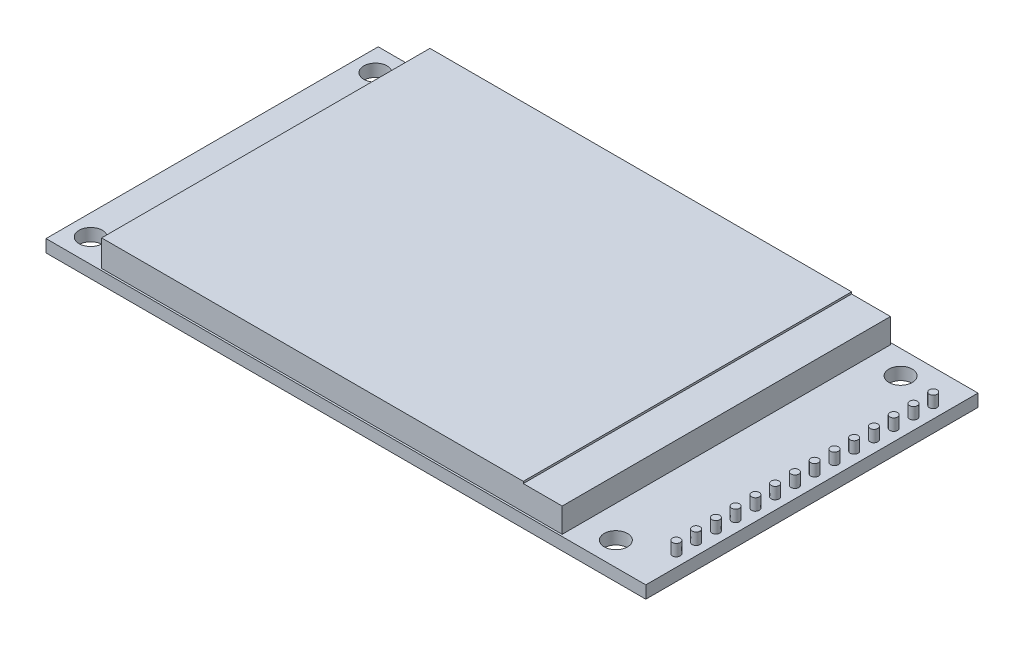
ISO-10303-21;
HEADER;
FILE_DESCRIPTION(('STEP AP214'),'2;1');
FILE_NAME('part.step','',(''),(''),'','','');
FILE_SCHEMA(('AUTOMOTIVE_DESIGN { 1 0 10303 214 1 1 1 1 }'));
ENDSEC;
DATA;
#1=APPLICATION_CONTEXT('core data for automotive mechanical design processes');
#2=APPLICATION_PROTOCOL_DEFINITION('international standard','automotive_design',2000,#1);
#3=PRODUCT_CONTEXT('',#1,'mechanical');
#4=PRODUCT('Part','Part','',(#3));
#5=PRODUCT_RELATED_PRODUCT_CATEGORY('part','',(#4));
#6=PRODUCT_DEFINITION_FORMATION('','',#4);
#7=PRODUCT_DEFINITION_CONTEXT('part definition',#1,'design');
#8=PRODUCT_DEFINITION('design','',#6,#7);
#9=PRODUCT_DEFINITION_SHAPE('','',#8);
#10=(LENGTH_UNIT() NAMED_UNIT(*) SI_UNIT(.MILLI.,.METRE.));
#11=(NAMED_UNIT(*) PLANE_ANGLE_UNIT() SI_UNIT($,.RADIAN.));
#12=(NAMED_UNIT(*) SI_UNIT($,.STERADIAN.) SOLID_ANGLE_UNIT());
#13=UNCERTAINTY_MEASURE_WITH_UNIT(LENGTH_MEASURE(1.E-05),#10,'distance_accuracy_value','');
#14=(GEOMETRIC_REPRESENTATION_CONTEXT(3) GLOBAL_UNCERTAINTY_ASSIGNED_CONTEXT((#13)) GLOBAL_UNIT_ASSIGNED_CONTEXT((#10,
#11,#12)) REPRESENTATION_CONTEXT('',''));
#15=CARTESIAN_POINT('',(0.,0.,0.));
#16=DIRECTION('',(0.,0.,1.));
#17=DIRECTION('',(1.,0.,0.));
#18=AXIS2_PLACEMENT_3D('',#15,#16,#17);
#19=CARTESIAN_POINT('',(27.55,82.7013067282838,21.1));
#20=DIRECTION('',(-1.,0.,0.));
#21=DIRECTION('',(0.,0.,1.));
#22=AXIS2_PLACEMENT_3D('',#19,#20,#21);
#23=PLANE('',#22);
#24=DIRECTION('',(0.,0.,-1.));
#25=VECTOR('',#24,1.);
#26=CARTESIAN_POINT('',(27.55,4.75,21.1));
#27=LINE('',#26,#25);
#28=CARTESIAN_POINT('',(27.55,4.75,21.1));
#29=VERTEX_POINT('',#28);
#30=CARTESIAN_POINT('',(27.55,4.75,-21.1));
#31=VERTEX_POINT('',#30);
#32=EDGE_CURVE('E66',#29,#31,#27,.T.);
#33=ORIENTED_EDGE('',*,*,#32,.F.);
#34=DIRECTION('',(0.,-1.,0.));
#35=VECTOR('',#34,1.);
#36=CARTESIAN_POINT('',(27.55,82.7013067282838,21.1));
#37=LINE('',#36,#35);
#38=CARTESIAN_POINT('',(27.55,1.6,21.1));
#39=VERTEX_POINT('',#38);
#40=EDGE_CURVE('E185',#29,#39,#37,.T.);
#41=ORIENTED_EDGE('',*,*,#40,.T.);
#42=DIRECTION('',(0.,0.,-1.));
#43=VECTOR('',#42,1.);
#44=CARTESIAN_POINT('',(27.55,1.6,21.1));
#45=LINE('',#44,#43);
#46=CARTESIAN_POINT('',(27.55,1.6,-21.1));
#47=VERTEX_POINT('',#46);
#48=EDGE_CURVE('E182',#39,#47,#45,.T.);
#49=ORIENTED_EDGE('',*,*,#48,.T.);
#50=DIRECTION('',(0.,-1.,0.));
#51=VECTOR('',#50,1.);
#52=CARTESIAN_POINT('',(27.55,82.7013067282838,-21.1));
#53=LINE('',#52,#51);
#54=EDGE_CURVE('E181',#31,#47,#53,.T.);
#55=ORIENTED_EDGE('',*,*,#54,.F.);
#56=EDGE_LOOP('',(#33,#41,#49,#55));
#57=FACE_BOUND('',#56,.T.);
#58=ADVANCED_FACE('F43',(#57),#23,.F.);
#59=CARTESIAN_POINT('',(27.55,82.7013067282838,21.1));
#60=DIRECTION('',(0.,0.,-1.));
#61=DIRECTION('',(-1.,0.,0.));
#62=AXIS2_PLACEMENT_3D('',#59,#60,#61);
#63=PLANE('',#62);
#64=DIRECTION('',(1.,0.,0.));
#65=VECTOR('',#64,1.);
#66=CARTESIAN_POINT('',(27.55,4.75,21.1));
#67=LINE('',#66,#65);
#68=CARTESIAN_POINT('',(22.55,4.75,21.1));
#69=VERTEX_POINT('',#68);
#70=EDGE_CURVE('E58',#69,#29,#67,.T.);
#71=ORIENTED_EDGE('',*,*,#70,.F.);
#72=DIRECTION('',(0.,-1.,0.));
#73=VECTOR('',#72,1.);
#74=CARTESIAN_POINT('',(22.55,82.7013067282838,21.1));
#75=LINE('',#74,#73);
#76=CARTESIAN_POINT('',(22.55,5.,21.1));
#77=VERTEX_POINT('',#76);
#78=EDGE_CURVE('E138',#77,#69,#75,.T.);
#79=ORIENTED_EDGE('',*,*,#78,.F.);
#80=DIRECTION('',(1.,0.,0.));
#81=VECTOR('',#80,1.);
#82=CARTESIAN_POINT('',(27.55,5.,21.1));
#83=LINE('',#82,#81);
#84=CARTESIAN_POINT('',(-31.65,5.,21.1));
#85=VERTEX_POINT('',#84);
#86=EDGE_CURVE('E136',#85,#77,#83,.T.);
#87=ORIENTED_EDGE('',*,*,#86,.F.);
#88=DIRECTION('',(0.,-1.,0.));
#89=VECTOR('',#88,1.);
#90=CARTESIAN_POINT('',(-31.65,82.7013067282838,21.1));
#91=LINE('',#90,#89);
#92=CARTESIAN_POINT('',(-31.65,1.6,21.1));
#93=VERTEX_POINT('',#92);
#94=EDGE_CURVE('E189',#85,#93,#91,.T.);
#95=ORIENTED_EDGE('',*,*,#94,.T.);
#96=DIRECTION('',(1.,0.,0.));
#97=VECTOR('',#96,1.);
#98=CARTESIAN_POINT('',(27.55,1.6,21.1));
#99=LINE('',#98,#97);
#100=EDGE_CURVE('E186',#93,#39,#99,.T.);
#101=ORIENTED_EDGE('',*,*,#100,.T.);
#102=ORIENTED_EDGE('',*,*,#40,.F.);
#103=EDGE_LOOP('',(#71,#79,#87,#95,#101,#102));
#104=FACE_BOUND('',#103,.T.);
#105=ADVANCED_FACE('F255',(#104),#63,.F.);
#106=CARTESIAN_POINT('',(27.55,82.7013067282838,-21.1));
#107=DIRECTION('',(0.,0.,1.));
#108=DIRECTION('',(1.,0.,0.));
#109=AXIS2_PLACEMENT_3D('',#106,#107,#108);
#110=PLANE('',#109);
#111=DIRECTION('',(-1.,0.,0.));
#112=VECTOR('',#111,1.);
#113=CARTESIAN_POINT('',(27.55,4.75,-21.1));
#114=LINE('',#113,#112);
#115=CARTESIAN_POINT('',(22.55,4.75,-21.1));
#116=VERTEX_POINT('',#115);
#117=EDGE_CURVE('E151',#31,#116,#114,.T.);
#118=ORIENTED_EDGE('',*,*,#117,.F.);
#119=ORIENTED_EDGE('',*,*,#54,.T.);
#120=DIRECTION('',(-1.,0.,0.));
#121=VECTOR('',#120,1.);
#122=CARTESIAN_POINT('',(27.55,1.6,-21.1));
#123=LINE('',#122,#121);
#124=CARTESIAN_POINT('',(-31.65,1.6,-21.1));
#125=VERTEX_POINT('',#124);
#126=EDGE_CURVE('E130',#47,#125,#123,.T.);
#127=ORIENTED_EDGE('',*,*,#126,.T.);
#128=DIRECTION('',(0.,-1.,0.));
#129=VECTOR('',#128,1.);
#130=CARTESIAN_POINT('',(-31.65,82.7013067282838,-21.1));
#131=LINE('',#130,#129);
#132=CARTESIAN_POINT('',(-31.65,5.,-21.1));
#133=VERTEX_POINT('',#132);
#134=EDGE_CURVE('E125',#133,#125,#131,.T.);
#135=ORIENTED_EDGE('',*,*,#134,.F.);
#136=DIRECTION('',(-1.,0.,0.));
#137=VECTOR('',#136,1.);
#138=CARTESIAN_POINT('',(27.55,5.,-21.1));
#139=LINE('',#138,#137);
#140=CARTESIAN_POINT('',(22.55,5.,-21.1));
#141=VERTEX_POINT('',#140);
#142=EDGE_CURVE('E120',#141,#133,#139,.T.);
#143=ORIENTED_EDGE('',*,*,#142,.F.);
#144=DIRECTION('',(0.,1.,0.));
#145=VECTOR('',#144,1.);
#146=CARTESIAN_POINT('',(22.55,82.7013067282838,-21.1));
#147=LINE('',#146,#145);
#148=EDGE_CURVE('E12',#116,#141,#147,.T.);
#149=ORIENTED_EDGE('',*,*,#148,.F.);
#150=EDGE_LOOP('',(#118,#119,#127,#135,#143,#149));
#151=FACE_BOUND('',#150,.T.);
#152=ADVANCED_FACE('F122',(#151),#110,.F.);
#153=CARTESIAN_POINT('',(0.,1.6,0.));
#154=DIRECTION('',(0.,1.,0.));
#155=DIRECTION('',(0.,0.,1.));
#156=AXIS2_PLACEMENT_3D('',#153,#154,#155);
#157=PLANE('',#156);
#158=CARTESIAN_POINT('',(37.0499999999999,1.6,-17.0967644922255));
#159=DIRECTION('',(0.,1.,0.));
#160=DIRECTION('',(0.,0.,1.));
#161=AXIS2_PLACEMENT_3D('',#158,#159,#160);
#162=CIRCLE('',#161,0.499999999999999);
#163=CARTESIAN_POINT('',(37.0499999999999,1.6,-16.5967644922255));
#164=VERTEX_POINT('',#163);
#165=EDGE_CURVE('E687',#164,#164,#162,.T.);
#166=ORIENTED_EDGE('',*,*,#165,.F.);
#167=EDGE_LOOP('',(#166));
#168=FACE_BOUND('',#167,.T.);
#169=CARTESIAN_POINT('',(37.0499999999999,1.6,-14.5567644922255));
#170=DIRECTION('',(0.,1.,0.));
#171=DIRECTION('',(0.,0.,1.));
#172=AXIS2_PLACEMENT_3D('',#169,#170,#171);
#173=CIRCLE('',#172,0.499999999999999);
#174=CARTESIAN_POINT('',(37.0499999999999,1.6,-14.0567644922255));
#175=VERTEX_POINT('',#174);
#176=EDGE_CURVE('E686',#175,#175,#173,.T.);
#177=ORIENTED_EDGE('',*,*,#176,.F.);
#178=EDGE_LOOP('',(#177));
#179=FACE_BOUND('',#178,.T.);
#180=CARTESIAN_POINT('',(37.0499999999999,1.6,-12.0167644922255));
#181=DIRECTION('',(0.,1.,0.));
#182=DIRECTION('',(0.,0.,1.));
#183=AXIS2_PLACEMENT_3D('',#180,#181,#182);
#184=CIRCLE('',#183,0.499999999999999);
#185=CARTESIAN_POINT('',(37.0499999999999,1.6,-11.5167644922255));
#186=VERTEX_POINT('',#185);
#187=EDGE_CURVE('E696',#186,#186,#184,.T.);
#188=ORIENTED_EDGE('',*,*,#187,.F.);
#189=EDGE_LOOP('',(#188));
#190=FACE_BOUND('',#189,.T.);
#191=CARTESIAN_POINT('',(37.0499999999999,1.6,-9.47676449222553));
#192=DIRECTION('',(0.,1.,0.));
#193=DIRECTION('',(0.,0.,1.));
#194=AXIS2_PLACEMENT_3D('',#191,#192,#193);
#195=CIRCLE('',#194,0.499999999999999);
#196=CARTESIAN_POINT('',(37.0499999999999,1.6,-8.97676449222553));
#197=VERTEX_POINT('',#196);
#198=EDGE_CURVE('E701',#197,#197,#195,.T.);
#199=ORIENTED_EDGE('',*,*,#198,.F.);
#200=EDGE_LOOP('',(#199));
#201=FACE_BOUND('',#200,.T.);
#202=CARTESIAN_POINT('',(37.0499999999999,1.6,-6.93676449222554));
#203=DIRECTION('',(0.,1.,0.));
#204=DIRECTION('',(0.,0.,1.));
#205=AXIS2_PLACEMENT_3D('',#202,#203,#204);
#206=CIRCLE('',#205,0.499999999999999);
#207=CARTESIAN_POINT('',(37.0499999999999,1.6,-6.43676449222554));
#208=VERTEX_POINT('',#207);
#209=EDGE_CURVE('E707',#208,#208,#206,.T.);
#210=ORIENTED_EDGE('',*,*,#209,.F.);
#211=EDGE_LOOP('',(#210));
#212=FACE_BOUND('',#211,.T.);
#213=CARTESIAN_POINT('',(37.0499999999999,1.6,-4.39676449222554));
#214=DIRECTION('',(0.,1.,0.));
#215=DIRECTION('',(0.,0.,1.));
#216=AXIS2_PLACEMENT_3D('',#213,#214,#215);
#217=CIRCLE('',#216,0.499999999999999);
#218=CARTESIAN_POINT('',(37.0499999999999,1.6,-3.89676449222554));
#219=VERTEX_POINT('',#218);
#220=EDGE_CURVE('E713',#219,#219,#217,.T.);
#221=ORIENTED_EDGE('',*,*,#220,.F.);
#222=EDGE_LOOP('',(#221));
#223=FACE_BOUND('',#222,.T.);
#224=CARTESIAN_POINT('',(37.0499999999999,1.6,-1.85676449222554));
#225=DIRECTION('',(0.,1.,0.));
#226=DIRECTION('',(0.,0.,1.));
#227=AXIS2_PLACEMENT_3D('',#224,#225,#226);
#228=CIRCLE('',#227,0.499999999999999);
#229=CARTESIAN_POINT('',(37.0499999999999,1.6,-1.35676449222554));
#230=VERTEX_POINT('',#229);
#231=EDGE_CURVE('E719',#230,#230,#228,.T.);
#232=ORIENTED_EDGE('',*,*,#231,.F.);
#233=EDGE_LOOP('',(#232));
#234=FACE_BOUND('',#233,.T.);
#235=CARTESIAN_POINT('',(37.0499999999999,1.6,0.683235507774462));
#236=DIRECTION('',(0.,1.,0.));
#237=DIRECTION('',(0.,0.,1.));
#238=AXIS2_PLACEMENT_3D('',#235,#236,#237);
#239=CIRCLE('',#238,0.499999999999999);
#240=CARTESIAN_POINT('',(37.0499999999999,1.6,1.18323550777446));
#241=VERTEX_POINT('',#240);
#242=EDGE_CURVE('E725',#241,#241,#239,.T.);
#243=ORIENTED_EDGE('',*,*,#242,.F.);
#244=EDGE_LOOP('',(#243));
#245=FACE_BOUND('',#244,.T.);
#246=CARTESIAN_POINT('',(37.0499999999999,1.6,3.22323550777446));
#247=DIRECTION('',(0.,1.,0.));
#248=DIRECTION('',(0.,0.,1.));
#249=AXIS2_PLACEMENT_3D('',#246,#247,#248);
#250=CIRCLE('',#249,0.499999999999999);
#251=CARTESIAN_POINT('',(37.0499999999999,1.6,3.72323550777446));
#252=VERTEX_POINT('',#251);
#253=EDGE_CURVE('E731',#252,#252,#250,.T.);
#254=ORIENTED_EDGE('',*,*,#253,.F.);
#255=EDGE_LOOP('',(#254));
#256=FACE_BOUND('',#255,.T.);
#257=CARTESIAN_POINT('',(37.0499999999999,1.6,5.76323550777446));
#258=DIRECTION('',(0.,1.,0.));
#259=DIRECTION('',(0.,0.,1.));
#260=AXIS2_PLACEMENT_3D('',#257,#258,#259);
#261=CIRCLE('',#260,0.499999999999999);
#262=CARTESIAN_POINT('',(37.0499999999999,1.6,6.26323550777446));
#263=VERTEX_POINT('',#262);
#264=EDGE_CURVE('E737',#263,#263,#261,.T.);
#265=ORIENTED_EDGE('',*,*,#264,.F.);
#266=EDGE_LOOP('',(#265));
#267=FACE_BOUND('',#266,.T.);
#268=CARTESIAN_POINT('',(37.05,1.6,8.30323550777446));
#269=DIRECTION('',(0.,1.,0.));
#270=DIRECTION('',(0.,0.,1.));
#271=AXIS2_PLACEMENT_3D('',#268,#269,#270);
#272=CIRCLE('',#271,0.499999999999999);
#273=CARTESIAN_POINT('',(37.05,1.6,8.80323550777446));
#274=VERTEX_POINT('',#273);
#275=EDGE_CURVE('E743',#274,#274,#272,.T.);
#276=ORIENTED_EDGE('',*,*,#275,.F.);
#277=EDGE_LOOP('',(#276));
#278=FACE_BOUND('',#277,.T.);
#279=CARTESIAN_POINT('',(37.05,1.6,10.8432355077745));
#280=DIRECTION('',(0.,1.,0.));
#281=DIRECTION('',(0.,0.,1.));
#282=AXIS2_PLACEMENT_3D('',#279,#280,#281);
#283=CIRCLE('',#282,0.499999999999999);
#284=CARTESIAN_POINT('',(37.05,1.6,11.3432355077745));
#285=VERTEX_POINT('',#284);
#286=EDGE_CURVE('E749',#285,#285,#283,.T.);
#287=ORIENTED_EDGE('',*,*,#286,.F.);
#288=EDGE_LOOP('',(#287));
#289=FACE_BOUND('',#288,.T.);
#290=CARTESIAN_POINT('',(37.05,1.6,13.3832355077745));
#291=DIRECTION('',(0.,1.,0.));
#292=DIRECTION('',(0.,0.,1.));
#293=AXIS2_PLACEMENT_3D('',#290,#291,#292);
#294=CIRCLE('',#293,0.499999999999999);
#295=CARTESIAN_POINT('',(37.05,1.6,13.8832355077745));
#296=VERTEX_POINT('',#295);
#297=EDGE_CURVE('E755',#296,#296,#294,.T.);
#298=ORIENTED_EDGE('',*,*,#297,.F.);
#299=EDGE_LOOP('',(#298));
#300=FACE_BOUND('',#299,.T.);
#301=CARTESIAN_POINT('',(37.05,1.6,15.9232355077745));
#302=DIRECTION('',(0.,1.,0.));
#303=DIRECTION('',(0.,0.,1.));
#304=AXIS2_PLACEMENT_3D('',#301,#302,#303);
#305=CIRCLE('',#304,0.499999999999999);
#306=CARTESIAN_POINT('',(37.05,1.6,16.4232355077745));
#307=VERTEX_POINT('',#306);
#308=EDGE_CURVE('E148',#307,#307,#305,.T.);
#309=ORIENTED_EDGE('',*,*,#308,.F.);
#310=EDGE_LOOP('',(#309));
#311=FACE_BOUND('',#310,.T.);
#312=CARTESIAN_POINT('',(31.65,1.6,18.3));
#313=DIRECTION('',(0.,1.,0.));
#314=DIRECTION('',(0.,0.,1.));
#315=AXIS2_PLACEMENT_3D('',#312,#313,#314);
#316=CIRCLE('',#315,1.5);
#317=CARTESIAN_POINT('',(31.65,1.6,19.8));
#318=VERTEX_POINT('',#317);
#319=EDGE_CURVE('E161',#318,#318,#316,.F.);
#320=ORIENTED_EDGE('',*,*,#319,.T.);
#321=EDGE_LOOP('',(#320));
#322=FACE_BOUND('',#321,.T.);
#323=CARTESIAN_POINT('',(31.65,1.6,-18.3));
#324=DIRECTION('',(0.,1.,0.));
#325=DIRECTION('',(0.,0.,1.));
#326=AXIS2_PLACEMENT_3D('',#323,#324,#325);
#327=CIRCLE('',#326,1.5);
#328=CARTESIAN_POINT('',(31.65,1.6,-16.8));
#329=VERTEX_POINT('',#328);
#330=EDGE_CURVE('E167',#329,#329,#327,.F.);
#331=ORIENTED_EDGE('',*,*,#330,.T.);
#332=EDGE_LOOP('',(#331));
#333=FACE_BOUND('',#332,.T.);
#334=CARTESIAN_POINT('',(-35.85,1.6,-18.3));
#335=DIRECTION('',(0.,1.,0.));
#336=DIRECTION('',(0.,0.,1.));
#337=AXIS2_PLACEMENT_3D('',#334,#335,#336);
#338=CIRCLE('',#337,1.5);
#339=CARTESIAN_POINT('',(-35.85,1.6,-16.8));
#340=VERTEX_POINT('',#339);
#341=EDGE_CURVE('E156',#340,#340,#338,.F.);
#342=ORIENTED_EDGE('',*,*,#341,.T.);
#343=EDGE_LOOP('',(#342));
#344=FACE_BOUND('',#343,.T.);
#345=CARTESIAN_POINT('',(-35.85,1.6,18.3));
#346=DIRECTION('',(0.,1.,0.));
#347=DIRECTION('',(0.,0.,1.));
#348=AXIS2_PLACEMENT_3D('',#345,#346,#347);
#349=CIRCLE('',#348,1.5);
#350=CARTESIAN_POINT('',(-35.85,1.6,19.8));
#351=VERTEX_POINT('',#350);
#352=EDGE_CURVE('E160',#351,#351,#349,.F.);
#353=ORIENTED_EDGE('',*,*,#352,.T.);
#354=EDGE_LOOP('',(#353));
#355=FACE_BOUND('',#354,.T.);
#356=DIRECTION('',(0.,0.,1.));
#357=VECTOR('',#356,1.);
#358=CARTESIAN_POINT('',(-38.55,1.6,21.35));
#359=LINE('',#358,#357);
#360=CARTESIAN_POINT('',(-38.55,1.6,-21.35));
#361=VERTEX_POINT('',#360);
#362=CARTESIAN_POINT('',(-38.55,1.6,21.35));
#363=VERTEX_POINT('',#362);
#364=EDGE_CURVE('E200',#361,#363,#359,.T.);
#365=ORIENTED_EDGE('',*,*,#364,.T.);
#366=DIRECTION('',(1.,0.,0.));
#367=VECTOR('',#366,1.);
#368=CARTESIAN_POINT('',(38.55,1.6,21.35));
#369=LINE('',#368,#367);
#370=CARTESIAN_POINT('',(38.55,1.6,21.35));
#371=VERTEX_POINT('',#370);
#372=EDGE_CURVE('E203',#363,#371,#369,.T.);
#373=ORIENTED_EDGE('',*,*,#372,.T.);
#374=DIRECTION('',(0.,0.,-1.));
#375=VECTOR('',#374,1.);
#376=CARTESIAN_POINT('',(38.55,1.6,21.35));
#377=LINE('',#376,#375);
#378=CARTESIAN_POINT('',(38.55,1.6,-21.35));
#379=VERTEX_POINT('',#378);
#380=EDGE_CURVE('E206',#371,#379,#377,.T.);
#381=ORIENTED_EDGE('',*,*,#380,.T.);
#382=DIRECTION('',(-1.,0.,0.));
#383=VECTOR('',#382,1.);
#384=CARTESIAN_POINT('',(38.55,1.6,-21.35));
#385=LINE('',#384,#383);
#386=EDGE_CURVE('E208',#379,#361,#385,.T.);
#387=ORIENTED_EDGE('',*,*,#386,.T.);
#388=EDGE_LOOP('',(#365,#373,#381,#387));
#389=FACE_BOUND('',#388,.T.);
#390=ORIENTED_EDGE('',*,*,#100,.F.);
#391=DIRECTION('',(0.,0.,1.));
#392=VECTOR('',#391,1.);
#393=CARTESIAN_POINT('',(-31.65,1.6,21.1));
#394=LINE('',#393,#392);
#395=EDGE_CURVE('E190',#125,#93,#394,.T.);
#396=ORIENTED_EDGE('',*,*,#395,.F.);
#397=ORIENTED_EDGE('',*,*,#126,.F.);
#398=ORIENTED_EDGE('',*,*,#48,.F.);
#399=EDGE_LOOP('',(#390,#396,#397,#398));
#400=FACE_BOUND('',#399,.T.);
#401=ADVANCED_FACE('F246',(#168,#179,#190,#201,#212,#223,#234,#245,#256,#267,#278,#289,#300,
#311,#322,#333,#344,#355,#389,#400),#157,.T.);
#402=CARTESIAN_POINT('',(-38.55,1.6,21.35));
#403=DIRECTION('',(1.,0.,0.));
#404=DIRECTION('',(0.,0.,-1.));
#405=AXIS2_PLACEMENT_3D('',#402,#403,#404);
#406=PLANE('',#405);
#407=DIRECTION('',(0.,0.,1.));
#408=VECTOR('',#407,1.);
#409=CARTESIAN_POINT('',(-38.55,0.,21.35));
#410=LINE('',#409,#408);
#411=CARTESIAN_POINT('',(-38.55,0.,-21.35));
#412=VERTEX_POINT('',#411);
#413=CARTESIAN_POINT('',(-38.55,0.,21.35));
#414=VERTEX_POINT('',#413);
#415=EDGE_CURVE('E194',#412,#414,#410,.T.);
#416=ORIENTED_EDGE('',*,*,#415,.T.);
#417=DIRECTION('',(0.,-1.,0.));
#418=VECTOR('',#417,1.);
#419=CARTESIAN_POINT('',(-38.55,1.6,21.35));
#420=LINE('',#419,#418);
#421=EDGE_CURVE('E51',#363,#414,#420,.T.);
#422=ORIENTED_EDGE('',*,*,#421,.F.);
#423=ORIENTED_EDGE('',*,*,#364,.F.);
#424=DIRECTION('',(0.,-1.,0.));
#425=VECTOR('',#424,1.);
#426=CARTESIAN_POINT('',(-38.55,1.6,-21.35));
#427=LINE('',#426,#425);
#428=EDGE_CURVE('E210',#361,#412,#427,.T.);
#429=ORIENTED_EDGE('',*,*,#428,.T.);
#430=EDGE_LOOP('',(#416,#422,#423,#429));
#431=FACE_BOUND('',#430,.T.);
#432=ADVANCED_FACE('F45',(#431),#406,.F.);
#433=CARTESIAN_POINT('',(38.55,1.6,21.35));
#434=DIRECTION('',(0.,0.,-1.));
#435=DIRECTION('',(-1.,0.,0.));
#436=AXIS2_PLACEMENT_3D('',#433,#434,#435);
#437=PLANE('',#436);
#438=DIRECTION('',(1.,0.,0.));
#439=VECTOR('',#438,1.);
#440=CARTESIAN_POINT('',(38.55,0.,21.35));
#441=LINE('',#440,#439);
#442=CARTESIAN_POINT('',(38.55,0.,21.35));
#443=VERTEX_POINT('',#442);
#444=EDGE_CURVE('E213',#414,#443,#441,.T.);
#445=ORIENTED_EDGE('',*,*,#444,.T.);
#446=DIRECTION('',(0.,-1.,0.));
#447=VECTOR('',#446,1.);
#448=CARTESIAN_POINT('',(38.55,1.6,21.35));
#449=LINE('',#448,#447);
#450=EDGE_CURVE('E223',#371,#443,#449,.T.);
#451=ORIENTED_EDGE('',*,*,#450,.F.);
#452=ORIENTED_EDGE('',*,*,#372,.F.);
#453=ORIENTED_EDGE('',*,*,#421,.T.);
#454=EDGE_LOOP('',(#445,#451,#452,#453));
#455=FACE_BOUND('',#454,.T.);
#456=ADVANCED_FACE('F228',(#455),#437,.F.);
#457=CARTESIAN_POINT('',(38.55,1.6,21.35));
#458=DIRECTION('',(-1.,0.,0.));
#459=DIRECTION('',(0.,0.,1.));
#460=AXIS2_PLACEMENT_3D('',#457,#458,#459);
#461=PLANE('',#460);
#462=DIRECTION('',(0.,0.,-1.));
#463=VECTOR('',#462,1.);
#464=CARTESIAN_POINT('',(38.55,0.,21.35));
#465=LINE('',#464,#463);
#466=CARTESIAN_POINT('',(38.55,0.,-21.35));
#467=VERTEX_POINT('',#466);
#468=EDGE_CURVE('E215',#443,#467,#465,.T.);
#469=ORIENTED_EDGE('',*,*,#468,.T.);
#470=DIRECTION('',(0.,-1.,0.));
#471=VECTOR('',#470,1.);
#472=CARTESIAN_POINT('',(38.55,1.6,-21.35));
#473=LINE('',#472,#471);
#474=EDGE_CURVE('E220',#379,#467,#473,.T.);
#475=ORIENTED_EDGE('',*,*,#474,.F.);
#476=ORIENTED_EDGE('',*,*,#380,.F.);
#477=ORIENTED_EDGE('',*,*,#450,.T.);
#478=EDGE_LOOP('',(#469,#475,#476,#477));
#479=FACE_BOUND('',#478,.T.);
#480=ADVANCED_FACE('F240',(#479),#461,.F.);
#481=CARTESIAN_POINT('',(38.55,1.6,-21.35));
#482=DIRECTION('',(0.,0.,1.));
#483=DIRECTION('',(1.,0.,0.));
#484=AXIS2_PLACEMENT_3D('',#481,#482,#483);
#485=PLANE('',#484);
#486=DIRECTION('',(-1.,0.,0.));
#487=VECTOR('',#486,1.);
#488=CARTESIAN_POINT('',(38.55,0.,-21.35));
#489=LINE('',#488,#487);
#490=EDGE_CURVE('E204',#467,#412,#489,.T.);
#491=ORIENTED_EDGE('',*,*,#490,.T.);
#492=ORIENTED_EDGE('',*,*,#428,.F.);
#493=ORIENTED_EDGE('',*,*,#386,.F.);
#494=ORIENTED_EDGE('',*,*,#474,.T.);
#495=EDGE_LOOP('',(#491,#492,#493,#494));
#496=FACE_BOUND('',#495,.T.);
#497=ADVANCED_FACE('F244',(#496),#485,.F.);
#498=CARTESIAN_POINT('',(0.,0.,0.));
#499=DIRECTION('',(0.,1.,0.));
#500=DIRECTION('',(0.,0.,1.));
#501=AXIS2_PLACEMENT_3D('',#498,#499,#500);
#502=PLANE('',#501);
#503=CARTESIAN_POINT('',(31.65,0.,18.3));
#504=DIRECTION('',(0.,-1.,0.));
#505=DIRECTION('',(0.,0.,-1.));
#506=AXIS2_PLACEMENT_3D('',#503,#504,#505);
#507=CIRCLE('',#506,1.5);
#508=CARTESIAN_POINT('',(31.65,0.,16.8));
#509=VERTEX_POINT('',#508);
#510=EDGE_CURVE('E157',#509,#509,#507,.T.);
#511=ORIENTED_EDGE('',*,*,#510,.F.);
#512=EDGE_LOOP('',(#511));
#513=FACE_BOUND('',#512,.T.);
#514=CARTESIAN_POINT('',(31.65,0.,-18.3));
#515=DIRECTION('',(0.,-1.,0.));
#516=DIRECTION('',(0.,0.,-1.));
#517=AXIS2_PLACEMENT_3D('',#514,#515,#516);
#518=CIRCLE('',#517,1.5);
#519=CARTESIAN_POINT('',(31.65,0.,-19.8));
#520=VERTEX_POINT('',#519);
#521=EDGE_CURVE('E164',#520,#520,#518,.T.);
#522=ORIENTED_EDGE('',*,*,#521,.F.);
#523=EDGE_LOOP('',(#522));
#524=FACE_BOUND('',#523,.T.);
#525=CARTESIAN_POINT('',(-35.85,0.,-18.3));
#526=DIRECTION('',(0.,-1.,0.));
#527=DIRECTION('',(0.,0.,-1.));
#528=AXIS2_PLACEMENT_3D('',#525,#526,#527);
#529=CIRCLE('',#528,1.5);
#530=CARTESIAN_POINT('',(-35.85,0.,-19.8));
#531=VERTEX_POINT('',#530);
#532=EDGE_CURVE('E170',#531,#531,#529,.T.);
#533=ORIENTED_EDGE('',*,*,#532,.F.);
#534=EDGE_LOOP('',(#533));
#535=FACE_BOUND('',#534,.T.);
#536=CARTESIAN_POINT('',(-35.85,0.,18.3));
#537=DIRECTION('',(0.,-1.,0.));
#538=DIRECTION('',(0.,0.,-1.));
#539=AXIS2_PLACEMENT_3D('',#536,#537,#538);
#540=CIRCLE('',#539,1.5);
#541=CARTESIAN_POINT('',(-35.85,0.,16.8));
#542=VERTEX_POINT('',#541);
#543=EDGE_CURVE('E175',#542,#542,#540,.T.);
#544=ORIENTED_EDGE('',*,*,#543,.F.);
#545=EDGE_LOOP('',(#544));
#546=FACE_BOUND('',#545,.T.);
#547=ORIENTED_EDGE('',*,*,#415,.F.);
#548=ORIENTED_EDGE('',*,*,#490,.F.);
#549=ORIENTED_EDGE('',*,*,#468,.F.);
#550=ORIENTED_EDGE('',*,*,#444,.F.);
#551=EDGE_LOOP('',(#547,#548,#549,#550));
#552=FACE_BOUND('',#551,.T.);
#553=ADVANCED_FACE('F236',(#513,#524,#535,#546,#552),#502,.F.);
#554=CARTESIAN_POINT('',(-31.65,82.7013067282838,21.1));
#555=DIRECTION('',(1.,0.,0.));
#556=DIRECTION('',(0.,0.,-1.));
#557=AXIS2_PLACEMENT_3D('',#554,#555,#556);
#558=PLANE('',#557);
#559=DIRECTION('',(0.,0.,1.));
#560=VECTOR('',#559,1.);
#561=CARTESIAN_POINT('',(-31.65,5.,21.1));
#562=LINE('',#561,#560);
#563=EDGE_CURVE('E129',#133,#85,#562,.T.);
#564=ORIENTED_EDGE('',*,*,#563,.F.);
#565=ORIENTED_EDGE('',*,*,#134,.T.);
#566=ORIENTED_EDGE('',*,*,#395,.T.);
#567=ORIENTED_EDGE('',*,*,#94,.F.);
#568=EDGE_LOOP('',(#564,#565,#566,#567));
#569=FACE_BOUND('',#568,.T.);
#570=ADVANCED_FACE('F258',(#569),#558,.F.);
#571=CARTESIAN_POINT('',(0.,5.,0.));
#572=DIRECTION('',(0.,1.,0.));
#573=DIRECTION('',(0.,0.,1.));
#574=AXIS2_PLACEMENT_3D('',#571,#572,#573);
#575=PLANE('',#574);
#576=DIRECTION('',(0.,0.,1.));
#577=VECTOR('',#576,1.);
#578=CARTESIAN_POINT('',(22.55,5.,-21.1005132397331));
#579=LINE('',#578,#577);
#580=EDGE_CURVE('E134',#141,#77,#579,.T.);
#581=ORIENTED_EDGE('',*,*,#580,.F.);
#582=ORIENTED_EDGE('',*,*,#142,.T.);
#583=ORIENTED_EDGE('',*,*,#563,.T.);
#584=ORIENTED_EDGE('',*,*,#86,.T.);
#585=EDGE_LOOP('',(#581,#582,#583,#584));
#586=FACE_BOUND('',#585,.T.);
#587=ADVANCED_FACE('F135',(#586),#575,.T.);
#588=CARTESIAN_POINT('',(-35.85,5.001,18.3));
#589=DIRECTION('',(0.,-1.,0.));
#590=DIRECTION('',(0.,0.,-1.));
#591=AXIS2_PLACEMENT_3D('',#588,#589,#590);
#592=CYLINDRICAL_SURFACE('',#591,1.5);
#593=ORIENTED_EDGE('',*,*,#352,.F.);
#594=EDGE_LOOP('',(#593));
#595=FACE_BOUND('',#594,.T.);
#596=ORIENTED_EDGE('',*,*,#543,.T.);
#597=EDGE_LOOP('',(#596));
#598=FACE_BOUND('',#597,.T.);
#599=ADVANCED_FACE('F271',(#595,#598),#592,.F.);
#600=CARTESIAN_POINT('',(-35.85,5.001,-18.3));
#601=DIRECTION('',(0.,-1.,0.));
#602=DIRECTION('',(0.,0.,-1.));
#603=AXIS2_PLACEMENT_3D('',#600,#601,#602);
#604=CYLINDRICAL_SURFACE('',#603,1.5);
#605=ORIENTED_EDGE('',*,*,#341,.F.);
#606=EDGE_LOOP('',(#605));
#607=FACE_BOUND('',#606,.T.);
#608=ORIENTED_EDGE('',*,*,#532,.T.);
#609=EDGE_LOOP('',(#608));
#610=FACE_BOUND('',#609,.T.);
#611=ADVANCED_FACE('F326',(#607,#610),#604,.F.);
#612=CARTESIAN_POINT('',(31.65,5.001,-18.3));
#613=DIRECTION('',(0.,-1.,0.));
#614=DIRECTION('',(0.,0.,-1.));
#615=AXIS2_PLACEMENT_3D('',#612,#613,#614);
#616=CYLINDRICAL_SURFACE('',#615,1.5);
#617=ORIENTED_EDGE('',*,*,#330,.F.);
#618=EDGE_LOOP('',(#617));
#619=FACE_BOUND('',#618,.T.);
#620=ORIENTED_EDGE('',*,*,#521,.T.);
#621=EDGE_LOOP('',(#620));
#622=FACE_BOUND('',#621,.T.);
#623=ADVANCED_FACE('F315',(#619,#622),#616,.F.);
#624=CARTESIAN_POINT('',(31.65,5.001,18.3));
#625=DIRECTION('',(0.,-1.,0.));
#626=DIRECTION('',(0.,0.,-1.));
#627=AXIS2_PLACEMENT_3D('',#624,#625,#626);
#628=CYLINDRICAL_SURFACE('',#627,1.5);
#629=ORIENTED_EDGE('',*,*,#319,.F.);
#630=EDGE_LOOP('',(#629));
#631=FACE_BOUND('',#630,.T.);
#632=ORIENTED_EDGE('',*,*,#510,.T.);
#633=EDGE_LOOP('',(#632));
#634=FACE_BOUND('',#633,.T.);
#635=ADVANCED_FACE('F310',(#631,#634),#628,.F.);
#636=CARTESIAN_POINT('',(22.55,119.595338596608,-21.1005132397331));
#637=DIRECTION('',(1.,0.,0.));
#638=DIRECTION('',(0.,0.,-1.));
#639=AXIS2_PLACEMENT_3D('',#636,#637,#638);
#640=PLANE('',#639);
#641=ORIENTED_EDGE('',*,*,#580,.T.);
#642=ORIENTED_EDGE('',*,*,#78,.T.);
#643=DIRECTION('',(0.,0.,1.));
#644=VECTOR('',#643,1.);
#645=CARTESIAN_POINT('',(22.55,4.75,-21.1005132397331));
#646=LINE('',#645,#644);
#647=EDGE_CURVE('E139',#116,#69,#646,.T.);
#648=ORIENTED_EDGE('',*,*,#647,.F.);
#649=ORIENTED_EDGE('',*,*,#148,.T.);
#650=EDGE_LOOP('',(#641,#642,#648,#649));
#651=FACE_BOUND('',#650,.T.);
#652=ADVANCED_FACE('F142',(#651),#640,.T.);
#653=CARTESIAN_POINT('',(0.,4.75,0.));
#654=DIRECTION('',(0.,1.,0.));
#655=DIRECTION('',(0.,0.,1.));
#656=AXIS2_PLACEMENT_3D('',#653,#654,#655);
#657=PLANE('',#656);
#658=ORIENTED_EDGE('',*,*,#647,.T.);
#659=ORIENTED_EDGE('',*,*,#70,.T.);
#660=ORIENTED_EDGE('',*,*,#32,.T.);
#661=ORIENTED_EDGE('',*,*,#117,.T.);
#662=EDGE_LOOP('',(#658,#659,#660,#661));
#663=FACE_BOUND('',#662,.T.);
#664=ADVANCED_FACE('F388',(#663),#657,.T.);
#665=CARTESIAN_POINT('',(37.05,3.1,15.9232355077745));
#666=DIRECTION('',(0.,-1.,0.));
#667=DIRECTION('',(0.,0.,-1.));
#668=AXIS2_PLACEMENT_3D('',#665,#666,#667);
#669=CYLINDRICAL_SURFACE('',#668,0.499999999999999);
#670=CARTESIAN_POINT('',(37.05,3.1,15.9232355077745));
#671=DIRECTION('',(0.,1.,0.));
#672=DIRECTION('',(0.,0.,1.));
#673=AXIS2_PLACEMENT_3D('',#670,#671,#672);
#674=CIRCLE('',#673,0.499999999999999);
#675=CARTESIAN_POINT('',(37.05,3.1,16.4232355077745));
#676=VERTEX_POINT('',#675);
#677=EDGE_CURVE('E153',#676,#676,#674,.T.);
#678=ORIENTED_EDGE('',*,*,#677,.F.);
#679=EDGE_LOOP('',(#678));
#680=FACE_BOUND('',#679,.T.);
#681=ORIENTED_EDGE('',*,*,#308,.T.);
#682=EDGE_LOOP('',(#681));
#683=FACE_BOUND('',#682,.T.);
#684=ADVANCED_FACE('F396',(#680,#683),#669,.T.);
#685=CARTESIAN_POINT('',(37.05,3.1,15.9232355077745));
#686=DIRECTION('',(0.,1.,0.));
#687=DIRECTION('',(0.,0.,1.));
#688=AXIS2_PLACEMENT_3D('',#685,#686,#687);
#689=PLANE('',#688);
#690=ORIENTED_EDGE('',*,*,#677,.T.);
#691=EDGE_LOOP('',(#690));
#692=FACE_BOUND('',#691,.T.);
#693=ADVANCED_FACE('F409',(#692),#689,.T.);
#694=CARTESIAN_POINT('',(37.05,3.1,13.3832355077745));
#695=DIRECTION('',(0.,-1.,0.));
#696=DIRECTION('',(0.,0.,-1.));
#697=AXIS2_PLACEMENT_3D('',#694,#695,#696);
#698=CYLINDRICAL_SURFACE('',#697,0.499999999999999);
#699=CARTESIAN_POINT('',(37.05,3.1,13.3832355077745));
#700=DIRECTION('',(0.,1.,0.));
#701=DIRECTION('',(0.,0.,1.));
#702=AXIS2_PLACEMENT_3D('',#699,#700,#701);
#703=CIRCLE('',#702,0.499999999999999);
#704=CARTESIAN_POINT('',(37.05,3.1,13.8832355077745));
#705=VERTEX_POINT('',#704);
#706=EDGE_CURVE('E758',#705,#705,#703,.T.);
#707=ORIENTED_EDGE('',*,*,#706,.F.);
#708=EDGE_LOOP('',(#707));
#709=FACE_BOUND('',#708,.T.);
#710=ORIENTED_EDGE('',*,*,#297,.T.);
#711=EDGE_LOOP('',(#710));
#712=FACE_BOUND('',#711,.T.);
#713=ADVANCED_FACE('F419',(#709,#712),#698,.T.);
#714=CARTESIAN_POINT('',(37.05,3.1,13.3832355077745));
#715=DIRECTION('',(0.,1.,0.));
#716=DIRECTION('',(0.,0.,1.));
#717=AXIS2_PLACEMENT_3D('',#714,#715,#716);
#718=PLANE('',#717);
#719=ORIENTED_EDGE('',*,*,#706,.T.);
#720=EDGE_LOOP('',(#719));
#721=FACE_BOUND('',#720,.T.);
#722=ADVANCED_FACE('F429',(#721),#718,.T.);
#723=CARTESIAN_POINT('',(37.05,3.1,10.8432355077745));
#724=DIRECTION('',(0.,-1.,0.));
#725=DIRECTION('',(0.,0.,-1.));
#726=AXIS2_PLACEMENT_3D('',#723,#724,#725);
#727=CYLINDRICAL_SURFACE('',#726,0.499999999999999);
#728=CARTESIAN_POINT('',(37.05,3.1,10.8432355077745));
#729=DIRECTION('',(0.,1.,0.));
#730=DIRECTION('',(0.,0.,1.));
#731=AXIS2_PLACEMENT_3D('',#728,#729,#730);
#732=CIRCLE('',#731,0.499999999999999);
#733=CARTESIAN_POINT('',(37.05,3.1,11.3432355077745));
#734=VERTEX_POINT('',#733);
#735=EDGE_CURVE('E752',#734,#734,#732,.T.);
#736=ORIENTED_EDGE('',*,*,#735,.F.);
#737=EDGE_LOOP('',(#736));
#738=FACE_BOUND('',#737,.T.);
#739=ORIENTED_EDGE('',*,*,#286,.T.);
#740=EDGE_LOOP('',(#739));
#741=FACE_BOUND('',#740,.T.);
#742=ADVANCED_FACE('F439',(#738,#741),#727,.T.);
#743=CARTESIAN_POINT('',(37.05,3.1,10.8432355077745));
#744=DIRECTION('',(0.,1.,0.));
#745=DIRECTION('',(0.,0.,1.));
#746=AXIS2_PLACEMENT_3D('',#743,#744,#745);
#747=PLANE('',#746);
#748=ORIENTED_EDGE('',*,*,#735,.T.);
#749=EDGE_LOOP('',(#748));
#750=FACE_BOUND('',#749,.T.);
#751=ADVANCED_FACE('F449',(#750),#747,.T.);
#752=CARTESIAN_POINT('',(37.05,3.1,8.30323550777446));
#753=DIRECTION('',(0.,-1.,0.));
#754=DIRECTION('',(0.,0.,-1.));
#755=AXIS2_PLACEMENT_3D('',#752,#753,#754);
#756=CYLINDRICAL_SURFACE('',#755,0.499999999999999);
#757=CARTESIAN_POINT('',(37.05,3.1,8.30323550777446));
#758=DIRECTION('',(0.,1.,0.));
#759=DIRECTION('',(0.,0.,1.));
#760=AXIS2_PLACEMENT_3D('',#757,#758,#759);
#761=CIRCLE('',#760,0.499999999999999);
#762=CARTESIAN_POINT('',(37.05,3.1,8.80323550777446));
#763=VERTEX_POINT('',#762);
#764=EDGE_CURVE('E746',#763,#763,#761,.T.);
#765=ORIENTED_EDGE('',*,*,#764,.F.);
#766=EDGE_LOOP('',(#765));
#767=FACE_BOUND('',#766,.T.);
#768=ORIENTED_EDGE('',*,*,#275,.T.);
#769=EDGE_LOOP('',(#768));
#770=FACE_BOUND('',#769,.T.);
#771=ADVANCED_FACE('F459',(#767,#770),#756,.T.);
#772=CARTESIAN_POINT('',(37.05,3.1,8.30323550777446));
#773=DIRECTION('',(0.,1.,0.));
#774=DIRECTION('',(0.,0.,1.));
#775=AXIS2_PLACEMENT_3D('',#772,#773,#774);
#776=PLANE('',#775);
#777=ORIENTED_EDGE('',*,*,#764,.T.);
#778=EDGE_LOOP('',(#777));
#779=FACE_BOUND('',#778,.T.);
#780=ADVANCED_FACE('F469',(#779),#776,.T.);
#781=CARTESIAN_POINT('',(37.0499999999999,3.1,5.76323550777446));
#782=DIRECTION('',(0.,-1.,0.));
#783=DIRECTION('',(0.,0.,-1.));
#784=AXIS2_PLACEMENT_3D('',#781,#782,#783);
#785=CYLINDRICAL_SURFACE('',#784,0.499999999999999);
#786=CARTESIAN_POINT('',(37.0499999999999,3.1,5.76323550777446));
#787=DIRECTION('',(0.,1.,0.));
#788=DIRECTION('',(0.,0.,1.));
#789=AXIS2_PLACEMENT_3D('',#786,#787,#788);
#790=CIRCLE('',#789,0.499999999999999);
#791=CARTESIAN_POINT('',(37.0499999999999,3.1,6.26323550777446));
#792=VERTEX_POINT('',#791);
#793=EDGE_CURVE('E740',#792,#792,#790,.T.);
#794=ORIENTED_EDGE('',*,*,#793,.F.);
#795=EDGE_LOOP('',(#794));
#796=FACE_BOUND('',#795,.T.);
#797=ORIENTED_EDGE('',*,*,#264,.T.);
#798=EDGE_LOOP('',(#797));
#799=FACE_BOUND('',#798,.T.);
#800=ADVANCED_FACE('F479',(#796,#799),#785,.T.);
#801=CARTESIAN_POINT('',(37.0499999999999,3.1,5.76323550777446));
#802=DIRECTION('',(0.,1.,0.));
#803=DIRECTION('',(0.,0.,1.));
#804=AXIS2_PLACEMENT_3D('',#801,#802,#803);
#805=PLANE('',#804);
#806=ORIENTED_EDGE('',*,*,#793,.T.);
#807=EDGE_LOOP('',(#806));
#808=FACE_BOUND('',#807,.T.);
#809=ADVANCED_FACE('F489',(#808),#805,.T.);
#810=CARTESIAN_POINT('',(37.0499999999999,3.1,3.22323550777446));
#811=DIRECTION('',(0.,-1.,0.));
#812=DIRECTION('',(0.,0.,-1.));
#813=AXIS2_PLACEMENT_3D('',#810,#811,#812);
#814=CYLINDRICAL_SURFACE('',#813,0.499999999999999);
#815=CARTESIAN_POINT('',(37.0499999999999,3.1,3.22323550777446));
#816=DIRECTION('',(0.,1.,0.));
#817=DIRECTION('',(0.,0.,1.));
#818=AXIS2_PLACEMENT_3D('',#815,#816,#817);
#819=CIRCLE('',#818,0.499999999999999);
#820=CARTESIAN_POINT('',(37.0499999999999,3.1,3.72323550777446));
#821=VERTEX_POINT('',#820);
#822=EDGE_CURVE('E734',#821,#821,#819,.T.);
#823=ORIENTED_EDGE('',*,*,#822,.F.);
#824=EDGE_LOOP('',(#823));
#825=FACE_BOUND('',#824,.T.);
#826=ORIENTED_EDGE('',*,*,#253,.T.);
#827=EDGE_LOOP('',(#826));
#828=FACE_BOUND('',#827,.T.);
#829=ADVANCED_FACE('F499',(#825,#828),#814,.T.);
#830=CARTESIAN_POINT('',(37.0499999999999,3.1,3.22323550777446));
#831=DIRECTION('',(0.,1.,0.));
#832=DIRECTION('',(0.,0.,1.));
#833=AXIS2_PLACEMENT_3D('',#830,#831,#832);
#834=PLANE('',#833);
#835=ORIENTED_EDGE('',*,*,#822,.T.);
#836=EDGE_LOOP('',(#835));
#837=FACE_BOUND('',#836,.T.);
#838=ADVANCED_FACE('F509',(#837),#834,.T.);
#839=CARTESIAN_POINT('',(37.0499999999999,3.1,0.683235507774462));
#840=DIRECTION('',(0.,-1.,0.));
#841=DIRECTION('',(0.,0.,-1.));
#842=AXIS2_PLACEMENT_3D('',#839,#840,#841);
#843=CYLINDRICAL_SURFACE('',#842,0.499999999999999);
#844=CARTESIAN_POINT('',(37.0499999999999,3.1,0.683235507774462));
#845=DIRECTION('',(0.,1.,0.));
#846=DIRECTION('',(0.,0.,1.));
#847=AXIS2_PLACEMENT_3D('',#844,#845,#846);
#848=CIRCLE('',#847,0.499999999999999);
#849=CARTESIAN_POINT('',(37.0499999999999,3.1,1.18323550777446));
#850=VERTEX_POINT('',#849);
#851=EDGE_CURVE('E728',#850,#850,#848,.T.);
#852=ORIENTED_EDGE('',*,*,#851,.F.);
#853=EDGE_LOOP('',(#852));
#854=FACE_BOUND('',#853,.T.);
#855=ORIENTED_EDGE('',*,*,#242,.T.);
#856=EDGE_LOOP('',(#855));
#857=FACE_BOUND('',#856,.T.);
#858=ADVANCED_FACE('F519',(#854,#857),#843,.T.);
#859=CARTESIAN_POINT('',(37.0499999999999,3.1,0.683235507774462));
#860=DIRECTION('',(0.,1.,0.));
#861=DIRECTION('',(0.,0.,1.));
#862=AXIS2_PLACEMENT_3D('',#859,#860,#861);
#863=PLANE('',#862);
#864=ORIENTED_EDGE('',*,*,#851,.T.);
#865=EDGE_LOOP('',(#864));
#866=FACE_BOUND('',#865,.T.);
#867=ADVANCED_FACE('F529',(#866),#863,.T.);
#868=CARTESIAN_POINT('',(37.0499999999999,3.1,-1.85676449222554));
#869=DIRECTION('',(0.,-1.,0.));
#870=DIRECTION('',(0.,0.,-1.));
#871=AXIS2_PLACEMENT_3D('',#868,#869,#870);
#872=CYLINDRICAL_SURFACE('',#871,0.499999999999999);
#873=CARTESIAN_POINT('',(37.0499999999999,3.1,-1.85676449222554));
#874=DIRECTION('',(0.,1.,0.));
#875=DIRECTION('',(0.,0.,1.));
#876=AXIS2_PLACEMENT_3D('',#873,#874,#875);
#877=CIRCLE('',#876,0.499999999999999);
#878=CARTESIAN_POINT('',(37.0499999999999,3.1,-1.35676449222554));
#879=VERTEX_POINT('',#878);
#880=EDGE_CURVE('E722',#879,#879,#877,.T.);
#881=ORIENTED_EDGE('',*,*,#880,.F.);
#882=EDGE_LOOP('',(#881));
#883=FACE_BOUND('',#882,.T.);
#884=ORIENTED_EDGE('',*,*,#231,.T.);
#885=EDGE_LOOP('',(#884));
#886=FACE_BOUND('',#885,.T.);
#887=ADVANCED_FACE('F539',(#883,#886),#872,.T.);
#888=CARTESIAN_POINT('',(37.0499999999999,3.1,-1.85676449222554));
#889=DIRECTION('',(0.,1.,0.));
#890=DIRECTION('',(0.,0.,1.));
#891=AXIS2_PLACEMENT_3D('',#888,#889,#890);
#892=PLANE('',#891);
#893=ORIENTED_EDGE('',*,*,#880,.T.);
#894=EDGE_LOOP('',(#893));
#895=FACE_BOUND('',#894,.T.);
#896=ADVANCED_FACE('F549',(#895),#892,.T.);
#897=CARTESIAN_POINT('',(37.0499999999999,3.1,-4.39676449222554));
#898=DIRECTION('',(0.,-1.,0.));
#899=DIRECTION('',(0.,0.,-1.));
#900=AXIS2_PLACEMENT_3D('',#897,#898,#899);
#901=CYLINDRICAL_SURFACE('',#900,0.499999999999999);
#902=CARTESIAN_POINT('',(37.0499999999999,3.1,-4.39676449222554));
#903=DIRECTION('',(0.,1.,0.));
#904=DIRECTION('',(0.,0.,1.));
#905=AXIS2_PLACEMENT_3D('',#902,#903,#904);
#906=CIRCLE('',#905,0.499999999999999);
#907=CARTESIAN_POINT('',(37.0499999999999,3.1,-3.89676449222554));
#908=VERTEX_POINT('',#907);
#909=EDGE_CURVE('E716',#908,#908,#906,.T.);
#910=ORIENTED_EDGE('',*,*,#909,.F.);
#911=EDGE_LOOP('',(#910));
#912=FACE_BOUND('',#911,.T.);
#913=ORIENTED_EDGE('',*,*,#220,.T.);
#914=EDGE_LOOP('',(#913));
#915=FACE_BOUND('',#914,.T.);
#916=ADVANCED_FACE('F559',(#912,#915),#901,.T.);
#917=CARTESIAN_POINT('',(37.0499999999999,3.1,-4.39676449222554));
#918=DIRECTION('',(0.,1.,0.));
#919=DIRECTION('',(0.,0.,1.));
#920=AXIS2_PLACEMENT_3D('',#917,#918,#919);
#921=PLANE('',#920);
#922=ORIENTED_EDGE('',*,*,#909,.T.);
#923=EDGE_LOOP('',(#922));
#924=FACE_BOUND('',#923,.T.);
#925=ADVANCED_FACE('F569',(#924),#921,.T.);
#926=CARTESIAN_POINT('',(37.0499999999999,3.1,-6.93676449222554));
#927=DIRECTION('',(0.,-1.,0.));
#928=DIRECTION('',(0.,0.,-1.));
#929=AXIS2_PLACEMENT_3D('',#926,#927,#928);
#930=CYLINDRICAL_SURFACE('',#929,0.499999999999999);
#931=CARTESIAN_POINT('',(37.0499999999999,3.1,-6.93676449222554));
#932=DIRECTION('',(0.,1.,0.));
#933=DIRECTION('',(0.,0.,1.));
#934=AXIS2_PLACEMENT_3D('',#931,#932,#933);
#935=CIRCLE('',#934,0.499999999999999);
#936=CARTESIAN_POINT('',(37.0499999999999,3.1,-6.43676449222554));
#937=VERTEX_POINT('',#936);
#938=EDGE_CURVE('E710',#937,#937,#935,.T.);
#939=ORIENTED_EDGE('',*,*,#938,.F.);
#940=EDGE_LOOP('',(#939));
#941=FACE_BOUND('',#940,.T.);
#942=ORIENTED_EDGE('',*,*,#209,.T.);
#943=EDGE_LOOP('',(#942));
#944=FACE_BOUND('',#943,.T.);
#945=ADVANCED_FACE('F579',(#941,#944),#930,.T.);
#946=CARTESIAN_POINT('',(37.0499999999999,3.1,-6.93676449222554));
#947=DIRECTION('',(0.,1.,0.));
#948=DIRECTION('',(0.,0.,1.));
#949=AXIS2_PLACEMENT_3D('',#946,#947,#948);
#950=PLANE('',#949);
#951=ORIENTED_EDGE('',*,*,#938,.T.);
#952=EDGE_LOOP('',(#951));
#953=FACE_BOUND('',#952,.T.);
#954=ADVANCED_FACE('F589',(#953),#950,.T.);
#955=CARTESIAN_POINT('',(37.0499999999999,3.1,-9.47676449222553));
#956=DIRECTION('',(0.,-1.,0.));
#957=DIRECTION('',(0.,0.,-1.));
#958=AXIS2_PLACEMENT_3D('',#955,#956,#957);
#959=CYLINDRICAL_SURFACE('',#958,0.499999999999999);
#960=CARTESIAN_POINT('',(37.0499999999999,3.1,-9.47676449222553));
#961=DIRECTION('',(0.,1.,0.));
#962=DIRECTION('',(0.,0.,1.));
#963=AXIS2_PLACEMENT_3D('',#960,#961,#962);
#964=CIRCLE('',#963,0.499999999999999);
#965=CARTESIAN_POINT('',(37.0499999999999,3.1,-8.97676449222553));
#966=VERTEX_POINT('',#965);
#967=EDGE_CURVE('E704',#966,#966,#964,.T.);
#968=ORIENTED_EDGE('',*,*,#967,.F.);
#969=EDGE_LOOP('',(#968));
#970=FACE_BOUND('',#969,.T.);
#971=ORIENTED_EDGE('',*,*,#198,.T.);
#972=EDGE_LOOP('',(#971));
#973=FACE_BOUND('',#972,.T.);
#974=ADVANCED_FACE('F599',(#970,#973),#959,.T.);
#975=CARTESIAN_POINT('',(37.0499999999999,3.1,-9.47676449222553));
#976=DIRECTION('',(0.,1.,0.));
#977=DIRECTION('',(0.,0.,1.));
#978=AXIS2_PLACEMENT_3D('',#975,#976,#977);
#979=PLANE('',#978);
#980=ORIENTED_EDGE('',*,*,#967,.T.);
#981=EDGE_LOOP('',(#980));
#982=FACE_BOUND('',#981,.T.);
#983=ADVANCED_FACE('F609',(#982),#979,.T.);
#984=CARTESIAN_POINT('',(37.0499999999999,3.1,-12.0167644922255));
#985=DIRECTION('',(0.,-1.,0.));
#986=DIRECTION('',(0.,0.,-1.));
#987=AXIS2_PLACEMENT_3D('',#984,#985,#986);
#988=CYLINDRICAL_SURFACE('',#987,0.499999999999999);
#989=CARTESIAN_POINT('',(37.0499999999999,3.1,-12.0167644922255));
#990=DIRECTION('',(0.,1.,0.));
#991=DIRECTION('',(0.,0.,1.));
#992=AXIS2_PLACEMENT_3D('',#989,#990,#991);
#993=CIRCLE('',#992,0.499999999999999);
#994=CARTESIAN_POINT('',(37.0499999999999,3.1,-11.5167644922255));
#995=VERTEX_POINT('',#994);
#996=EDGE_CURVE('E698',#995,#995,#993,.T.);
#997=ORIENTED_EDGE('',*,*,#996,.F.);
#998=EDGE_LOOP('',(#997));
#999=FACE_BOUND('',#998,.T.);
#1000=ORIENTED_EDGE('',*,*,#187,.T.);
#1001=EDGE_LOOP('',(#1000));
#1002=FACE_BOUND('',#1001,.T.);
#1003=ADVANCED_FACE('F619',(#999,#1002),#988,.T.);
#1004=CARTESIAN_POINT('',(37.0499999999999,3.1,-12.0167644922255));
#1005=DIRECTION('',(0.,1.,0.));
#1006=DIRECTION('',(0.,0.,1.));
#1007=AXIS2_PLACEMENT_3D('',#1004,#1005,#1006);
#1008=PLANE('',#1007);
#1009=ORIENTED_EDGE('',*,*,#996,.T.);
#1010=EDGE_LOOP('',(#1009));
#1011=FACE_BOUND('',#1010,.T.);
#1012=ADVANCED_FACE('F629',(#1011),#1008,.T.);
#1013=CARTESIAN_POINT('',(37.0499999999999,3.1,-14.5567644922255));
#1014=DIRECTION('',(0.,-1.,0.));
#1015=DIRECTION('',(0.,0.,-1.));
#1016=AXIS2_PLACEMENT_3D('',#1013,#1014,#1015);
#1017=CYLINDRICAL_SURFACE('',#1016,0.499999999999999);
#1018=CARTESIAN_POINT('',(37.0499999999999,3.1,-14.5567644922255));
#1019=DIRECTION('',(0.,1.,0.));
#1020=DIRECTION('',(0.,0.,1.));
#1021=AXIS2_PLACEMENT_3D('',#1018,#1019,#1020);
#1022=CIRCLE('',#1021,0.499999999999999);
#1023=CARTESIAN_POINT('',(37.0499999999999,3.1,-14.0567644922255));
#1024=VERTEX_POINT('',#1023);
#1025=EDGE_CURVE('E690',#1024,#1024,#1022,.T.);
#1026=ORIENTED_EDGE('',*,*,#1025,.F.);
#1027=EDGE_LOOP('',(#1026));
#1028=FACE_BOUND('',#1027,.T.);
#1029=ORIENTED_EDGE('',*,*,#176,.T.);
#1030=EDGE_LOOP('',(#1029));
#1031=FACE_BOUND('',#1030,.T.);
#1032=ADVANCED_FACE('F639',(#1028,#1031),#1017,.T.);
#1033=CARTESIAN_POINT('',(37.0499999999999,3.1,-14.5567644922255));
#1034=DIRECTION('',(0.,1.,0.));
#1035=DIRECTION('',(0.,0.,1.));
#1036=AXIS2_PLACEMENT_3D('',#1033,#1034,#1035);
#1037=PLANE('',#1036);
#1038=ORIENTED_EDGE('',*,*,#1025,.T.);
#1039=EDGE_LOOP('',(#1038));
#1040=FACE_BOUND('',#1039,.T.);
#1041=ADVANCED_FACE('F649',(#1040),#1037,.T.);
#1042=CARTESIAN_POINT('',(37.0499999999999,3.1,-17.0967644922255));
#1043=DIRECTION('',(0.,-1.,0.));
#1044=DIRECTION('',(0.,0.,-1.));
#1045=AXIS2_PLACEMENT_3D('',#1042,#1043,#1044);
#1046=CYLINDRICAL_SURFACE('',#1045,0.499999999999999);
#1047=CARTESIAN_POINT('',(37.0499999999999,3.1,-17.0967644922255));
#1048=DIRECTION('',(0.,1.,0.));
#1049=DIRECTION('',(0.,0.,1.));
#1050=AXIS2_PLACEMENT_3D('',#1047,#1048,#1049);
#1051=CIRCLE('',#1050,0.499999999999999);
#1052=CARTESIAN_POINT('',(37.0499999999999,3.1,-16.5967644922255));
#1053=VERTEX_POINT('',#1052);
#1054=EDGE_CURVE('E685',#1053,#1053,#1051,.T.);
#1055=ORIENTED_EDGE('',*,*,#1054,.F.);
#1056=EDGE_LOOP('',(#1055));
#1057=FACE_BOUND('',#1056,.T.);
#1058=ORIENTED_EDGE('',*,*,#165,.T.);
#1059=EDGE_LOOP('',(#1058));
#1060=FACE_BOUND('',#1059,.T.);
#1061=ADVANCED_FACE('F659',(#1057,#1060),#1046,.T.);
#1062=CARTESIAN_POINT('',(37.0499999999999,3.1,-17.0967644922255));
#1063=DIRECTION('',(0.,1.,0.));
#1064=DIRECTION('',(0.,0.,1.));
#1065=AXIS2_PLACEMENT_3D('',#1062,#1063,#1064);
#1066=PLANE('',#1065);
#1067=ORIENTED_EDGE('',*,*,#1054,.T.);
#1068=EDGE_LOOP('',(#1067));
#1069=FACE_BOUND('',#1068,.T.);
#1070=ADVANCED_FACE('F669',(#1069),#1066,.T.);
#1071=CLOSED_SHELL('',(#58,#105,#152,#401,#432,#456,#480,#497,#553,#570,#587,#599,#611,#623,
#635,#652,#664,#684,#693,#713,#722,#742,#751,#771,#780,#800,#809,#829,#838,#858,#867,#887,#896,
#916,#925,#945,#954,#974,#983,#1003,#1012,#1032,#1041,#1061,#1070));
#1072=MANIFOLD_SOLID_BREP('B2',#1071);
#1073=ADVANCED_BREP_SHAPE_REPRESENTATION('',(#18,#1072),#14);
#1074=SHAPE_DEFINITION_REPRESENTATION(#9,#1073);
ENDSEC;
END-ISO-10303-21;
